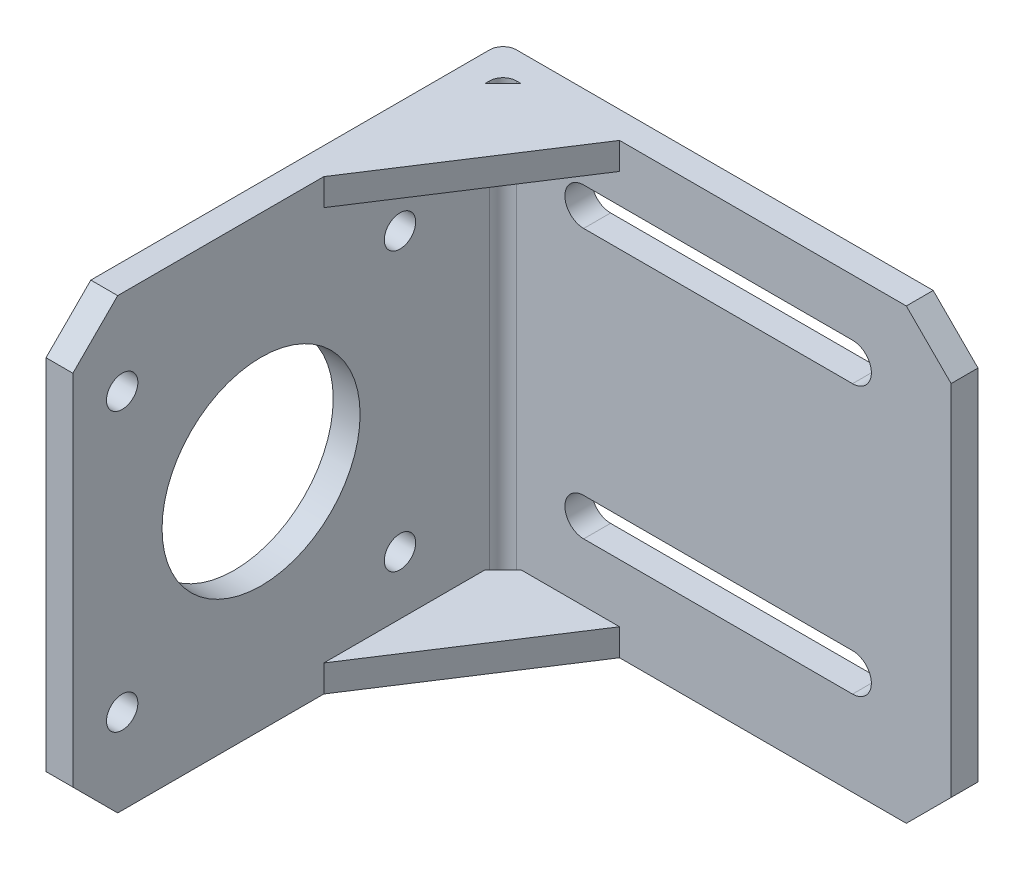
ISO-10303-21;
HEADER;
FILE_DESCRIPTION(('STEP AP214'),'2;1');
FILE_NAME('part.step','',(''),(''),'','','');
FILE_SCHEMA(('AUTOMOTIVE_DESIGN { 1 0 10303 214 1 1 1 1 }'));
ENDSEC;
DATA;
#1=APPLICATION_CONTEXT('core data for automotive mechanical design processes');
#2=APPLICATION_PROTOCOL_DEFINITION('international standard','automotive_design',2000,#1);
#3=PRODUCT_CONTEXT('',#1,'mechanical');
#4=PRODUCT('Part','Part','',(#3));
#5=PRODUCT_RELATED_PRODUCT_CATEGORY('part','',(#4));
#6=PRODUCT_DEFINITION_FORMATION('','',#4);
#7=PRODUCT_DEFINITION_CONTEXT('part definition',#1,'design');
#8=PRODUCT_DEFINITION('design','',#6,#7);
#9=PRODUCT_DEFINITION_SHAPE('','',#8);
#10=(LENGTH_UNIT() NAMED_UNIT(*) SI_UNIT(.MILLI.,.METRE.));
#11=(NAMED_UNIT(*) PLANE_ANGLE_UNIT() SI_UNIT($,.RADIAN.));
#12=(NAMED_UNIT(*) SI_UNIT($,.STERADIAN.) SOLID_ANGLE_UNIT());
#13=UNCERTAINTY_MEASURE_WITH_UNIT(LENGTH_MEASURE(1.E-05),#10,'distance_accuracy_value','');
#14=(GEOMETRIC_REPRESENTATION_CONTEXT(3) GLOBAL_UNCERTAINTY_ASSIGNED_CONTEXT((#13)) GLOBAL_UNIT_ASSIGNED_CONTEXT((#10,
#11,#12)) REPRESENTATION_CONTEXT('',''));
#15=CARTESIAN_POINT('',(0.,0.,0.));
#16=DIRECTION('',(0.,0.,1.));
#17=DIRECTION('',(1.,0.,0.));
#18=AXIS2_PLACEMENT_3D('',#15,#16,#17);
#19=CARTESIAN_POINT('',(0.,-36.3083617585939,3.));
#20=DIRECTION('',(0.,1.,0.));
#21=DIRECTION('',(-1.,0.,0.));
#22=AXIS2_PLACEMENT_3D('',#19,#20,#21);
#23=PLANE('',#22);
#24=DIRECTION('',(1.,0.,0.));
#25=VECTOR('',#24,1.);
#26=CARTESIAN_POINT('',(0.,-36.3083617585939,0.));
#27=LINE('',#26,#25);
#28=CARTESIAN_POINT('',(39.0369919094521,-36.3083617585939,0.));
#29=VERTEX_POINT('',#28);
#30=CARTESIAN_POINT('',(69.0369919094521,-36.3083617585939,0.));
#31=VERTEX_POINT('',#30);
#32=EDGE_CURVE('E306',#29,#31,#27,.T.);
#33=ORIENTED_EDGE('',*,*,#32,.T.);
#34=DIRECTION('',(0.,0.,-1.));
#35=VECTOR('',#34,1.);
#36=CARTESIAN_POINT('',(69.0369919094521,-36.3083617585939,3.));
#37=LINE('',#36,#35);
#38=CARTESIAN_POINT('',(69.0369919094521,-36.3083617585939,3.));
#39=VERTEX_POINT('',#38);
#40=EDGE_CURVE('E324',#39,#31,#37,.T.);
#41=ORIENTED_EDGE('',*,*,#40,.F.);
#42=DIRECTION('',(1.,0.,0.));
#43=VECTOR('',#42,1.);
#44=CARTESIAN_POINT('',(0.,-36.3083617585939,3.));
#45=LINE('',#44,#43);
#46=CARTESIAN_POINT('',(39.0369919094521,-36.3083617585939,3.));
#47=VERTEX_POINT('',#46);
#48=EDGE_CURVE('E276',#47,#39,#45,.T.);
#49=ORIENTED_EDGE('',*,*,#48,.F.);
#50=DIRECTION('',(0.,0.,-1.));
#51=VECTOR('',#50,1.);
#52=CARTESIAN_POINT('',(39.0369919094521,-36.3083617585939,3.));
#53=LINE('',#52,#51);
#54=EDGE_CURVE('E317',#47,#29,#53,.T.);
#55=ORIENTED_EDGE('',*,*,#54,.T.);
#56=EDGE_LOOP('',(#33,#41,#49,#55));
#57=FACE_BOUND('',#56,.T.);
#58=ADVANCED_FACE('F35',(#57),#23,.F.);
#59=CARTESIAN_POINT('',(69.0369919094521,-38.4083617585939,3.));
#60=DIRECTION('',(0.,0.,-1.));
#61=DIRECTION('',(-1.,0.,0.));
#62=AXIS2_PLACEMENT_3D('',#59,#60,#61);
#63=CYLINDRICAL_SURFACE('',#62,2.1);
#64=CARTESIAN_POINT('',(69.0369919094521,-38.4083617585939,0.));
#65=DIRECTION('',(0.,0.,1.));
#66=DIRECTION('',(1.,0.,0.));
#67=AXIS2_PLACEMENT_3D('',#64,#65,#66);
#68=CIRCLE('',#67,2.1);
#69=CARTESIAN_POINT('',(69.0369919094521,-40.5083617585939,0.));
#70=VERTEX_POINT('',#69);
#71=EDGE_CURVE('E309',#31,#70,#68,.F.);
#72=ORIENTED_EDGE('',*,*,#71,.T.);
#73=DIRECTION('',(0.,0.,-1.));
#74=VECTOR('',#73,1.);
#75=CARTESIAN_POINT('',(69.0369919094521,-40.5083617585939,3.));
#76=LINE('',#75,#74);
#77=CARTESIAN_POINT('',(69.0369919094521,-40.5083617585939,3.));
#78=VERTEX_POINT('',#77);
#79=EDGE_CURVE('E322',#78,#70,#76,.T.);
#80=ORIENTED_EDGE('',*,*,#79,.F.);
#81=CARTESIAN_POINT('',(69.0369919094521,-38.4083617585939,3.));
#82=DIRECTION('',(0.,0.,1.));
#83=DIRECTION('',(1.,0.,0.));
#84=AXIS2_PLACEMENT_3D('',#81,#82,#83);
#85=CIRCLE('',#84,2.1);
#86=EDGE_CURVE('E279',#39,#78,#85,.F.);
#87=ORIENTED_EDGE('',*,*,#86,.F.);
#88=ORIENTED_EDGE('',*,*,#40,.T.);
#89=EDGE_LOOP('',(#72,#80,#87,#88));
#90=FACE_BOUND('',#89,.T.);
#91=ADVANCED_FACE('F428',(#90),#63,.F.);
#92=CARTESIAN_POINT('',(0.,-40.5083617585939,3.));
#93=DIRECTION('',(0.,1.,0.));
#94=DIRECTION('',(0.,0.,1.));
#95=AXIS2_PLACEMENT_3D('',#92,#93,#94);
#96=PLANE('',#95);
#97=DIRECTION('',(1.,0.,0.));
#98=VECTOR('',#97,1.);
#99=CARTESIAN_POINT('',(0.,-40.5083617585939,0.));
#100=LINE('',#99,#98);
#101=CARTESIAN_POINT('',(39.0369919094521,-40.5083617585939,0.));
#102=VERTEX_POINT('',#101);
#103=EDGE_CURVE('E312',#102,#70,#100,.T.);
#104=ORIENTED_EDGE('',*,*,#103,.F.);
#105=DIRECTION('',(0.,0.,-1.));
#106=VECTOR('',#105,1.);
#107=CARTESIAN_POINT('',(39.0369919094521,-40.5083617585939,3.));
#108=LINE('',#107,#106);
#109=CARTESIAN_POINT('',(39.0369919094521,-40.5083617585939,3.));
#110=VERTEX_POINT('',#109);
#111=EDGE_CURVE('E319',#110,#102,#108,.T.);
#112=ORIENTED_EDGE('',*,*,#111,.F.);
#113=DIRECTION('',(1.,0.,0.));
#114=VECTOR('',#113,1.);
#115=CARTESIAN_POINT('',(0.,-40.5083617585939,3.));
#116=LINE('',#115,#114);
#117=EDGE_CURVE('E281',#110,#78,#116,.T.);
#118=ORIENTED_EDGE('',*,*,#117,.T.);
#119=ORIENTED_EDGE('',*,*,#79,.T.);
#120=EDGE_LOOP('',(#104,#112,#118,#119));
#121=FACE_BOUND('',#120,.T.);
#122=ADVANCED_FACE('F434',(#121),#96,.T.);
#123=CARTESIAN_POINT('',(0.,-10.508361758594,3.));
#124=DIRECTION('',(0.,1.,0.));
#125=DIRECTION('',(-1.,0.,0.));
#126=AXIS2_PLACEMENT_3D('',#123,#124,#125);
#127=PLANE('',#126);
#128=DIRECTION('',(1.,0.,0.));
#129=VECTOR('',#128,1.);
#130=CARTESIAN_POINT('',(0.,-10.508361758594,0.));
#131=LINE('',#130,#129);
#132=CARTESIAN_POINT('',(39.0369919094521,-10.5083617585939,0.));
#133=VERTEX_POINT('',#132);
#134=CARTESIAN_POINT('',(69.0369919094521,-10.5083617585939,0.));
#135=VERTEX_POINT('',#134);
#136=EDGE_CURVE('E294',#133,#135,#131,.T.);
#137=ORIENTED_EDGE('',*,*,#136,.F.);
#138=DIRECTION('',(0.,0.,-1.));
#139=VECTOR('',#138,1.);
#140=CARTESIAN_POINT('',(39.0369919094521,-10.5083617585939,3.));
#141=LINE('',#140,#139);
#142=CARTESIAN_POINT('',(39.0369919094521,-10.5083617585939,3.));
#143=VERTEX_POINT('',#142);
#144=EDGE_CURVE('E320',#143,#133,#141,.T.);
#145=ORIENTED_EDGE('',*,*,#144,.F.);
#146=DIRECTION('',(1.,0.,0.));
#147=VECTOR('',#146,1.);
#148=CARTESIAN_POINT('',(0.,-10.508361758594,3.));
#149=LINE('',#148,#147);
#150=CARTESIAN_POINT('',(69.0369919094521,-10.5083617585939,3.));
#151=VERTEX_POINT('',#150);
#152=EDGE_CURVE('E265',#143,#151,#149,.T.);
#153=ORIENTED_EDGE('',*,*,#152,.T.);
#154=DIRECTION('',(0.,0.,-1.));
#155=VECTOR('',#154,1.);
#156=CARTESIAN_POINT('',(69.0369919094521,-10.5083617585939,3.));
#157=LINE('',#156,#155);
#158=EDGE_CURVE('E328',#151,#135,#157,.T.);
#159=ORIENTED_EDGE('',*,*,#158,.T.);
#160=EDGE_LOOP('',(#137,#145,#153,#159));
#161=FACE_BOUND('',#160,.T.);
#162=ADVANCED_FACE('F452',(#161),#127,.T.);
#163=CARTESIAN_POINT('',(39.0369919094521,-8.40836175859393,3.));
#164=DIRECTION('',(0.,0.,-1.));
#165=DIRECTION('',(-1.,0.,0.));
#166=AXIS2_PLACEMENT_3D('',#163,#164,#165);
#167=CYLINDRICAL_SURFACE('',#166,2.1);
#168=CARTESIAN_POINT('',(39.0369919094521,-8.40836175859393,0.));
#169=DIRECTION('',(0.,0.,1.));
#170=DIRECTION('',(1.,0.,0.));
#171=AXIS2_PLACEMENT_3D('',#168,#169,#170);
#172=CIRCLE('',#171,2.1);
#173=CARTESIAN_POINT('',(39.0369919094521,-6.30836175859393,0.));
#174=VERTEX_POINT('',#173);
#175=EDGE_CURVE('E297',#133,#174,#172,.F.);
#176=ORIENTED_EDGE('',*,*,#175,.T.);
#177=DIRECTION('',(0.,0.,-1.));
#178=VECTOR('',#177,1.);
#179=CARTESIAN_POINT('',(39.0369919094521,-6.30836175859393,3.));
#180=LINE('',#179,#178);
#181=CARTESIAN_POINT('',(39.0369919094521,-6.30836175859393,3.));
#182=VERTEX_POINT('',#181);
#183=EDGE_CURVE('E334',#182,#174,#180,.T.);
#184=ORIENTED_EDGE('',*,*,#183,.F.);
#185=CARTESIAN_POINT('',(39.0369919094521,-8.40836175859393,3.));
#186=DIRECTION('',(0.,0.,1.));
#187=DIRECTION('',(1.,0.,0.));
#188=AXIS2_PLACEMENT_3D('',#185,#186,#187);
#189=CIRCLE('',#188,2.1);
#190=EDGE_CURVE('E268',#143,#182,#189,.F.);
#191=ORIENTED_EDGE('',*,*,#190,.F.);
#192=ORIENTED_EDGE('',*,*,#144,.T.);
#193=EDGE_LOOP('',(#176,#184,#191,#192));
#194=FACE_BOUND('',#193,.T.);
#195=ADVANCED_FACE('F448',(#194),#167,.F.);
#196=CARTESIAN_POINT('',(0.,-6.30836175859393,3.));
#197=DIRECTION('',(0.,1.,0.));
#198=DIRECTION('',(-1.,0.,0.));
#199=AXIS2_PLACEMENT_3D('',#196,#197,#198);
#200=PLANE('',#199);
#201=DIRECTION('',(1.,0.,0.));
#202=VECTOR('',#201,1.);
#203=CARTESIAN_POINT('',(0.,-6.30836175859393,0.));
#204=LINE('',#203,#202);
#205=CARTESIAN_POINT('',(69.0369919094521,-6.30836175859393,0.));
#206=VERTEX_POINT('',#205);
#207=EDGE_CURVE('E300',#174,#206,#204,.T.);
#208=ORIENTED_EDGE('',*,*,#207,.T.);
#209=DIRECTION('',(0.,0.,-1.));
#210=VECTOR('',#209,1.);
#211=CARTESIAN_POINT('',(69.0369919094521,-6.30836175859393,3.));
#212=LINE('',#211,#210);
#213=CARTESIAN_POINT('',(69.0369919094521,-6.30836175859393,3.));
#214=VERTEX_POINT('',#213);
#215=EDGE_CURVE('E330',#214,#206,#212,.T.);
#216=ORIENTED_EDGE('',*,*,#215,.F.);
#217=DIRECTION('',(1.,0.,0.));
#218=VECTOR('',#217,1.);
#219=CARTESIAN_POINT('',(0.,-6.30836175859393,3.));
#220=LINE('',#219,#218);
#221=EDGE_CURVE('E271',#182,#214,#220,.T.);
#222=ORIENTED_EDGE('',*,*,#221,.F.);
#223=ORIENTED_EDGE('',*,*,#183,.T.);
#224=EDGE_LOOP('',(#208,#216,#222,#223));
#225=FACE_BOUND('',#224,.T.);
#226=ADVANCED_FACE('F444',(#225),#200,.F.);
#227=CARTESIAN_POINT('',(80.0369919094521,0.,3.));
#228=DIRECTION('',(1.,0.,0.));
#229=DIRECTION('',(0.,1.,0.));
#230=AXIS2_PLACEMENT_3D('',#227,#228,#229);
#231=PLANE('',#230);
#232=DIRECTION('',(0.,-1.,0.));
#233=VECTOR('',#232,1.);
#234=CARTESIAN_POINT('',(80.0369919094521,0.,0.));
#235=LINE('',#234,#233);
#236=CARTESIAN_POINT('',(80.0369919094521,-4.99999999999999,0.));
#237=VERTEX_POINT('',#236);
#238=CARTESIAN_POINT('',(80.0369919094521,-45.,0.));
#239=VERTEX_POINT('',#238);
#240=EDGE_CURVE('E255',#237,#239,#235,.T.);
#241=ORIENTED_EDGE('',*,*,#240,.F.);
#242=DIRECTION('',(0.,0.,1.));
#243=VECTOR('',#242,1.);
#244=CARTESIAN_POINT('',(80.0369919094521,-4.99999999999999,3.));
#245=LINE('',#244,#243);
#246=CARTESIAN_POINT('',(80.0369919094521,-4.99999999999999,3.));
#247=VERTEX_POINT('',#246);
#248=EDGE_CURVE('E390',#237,#247,#245,.T.);
#249=ORIENTED_EDGE('',*,*,#248,.T.);
#250=DIRECTION('',(0.,-1.,0.));
#251=VECTOR('',#250,1.);
#252=CARTESIAN_POINT('',(80.0369919094521,0.,3.));
#253=LINE('',#252,#251);
#254=CARTESIAN_POINT('',(80.0369919094521,-45.,3.));
#255=VERTEX_POINT('',#254);
#256=EDGE_CURVE('E256',#247,#255,#253,.T.);
#257=ORIENTED_EDGE('',*,*,#256,.T.);
#258=DIRECTION('',(0.,0.,-1.));
#259=VECTOR('',#258,1.);
#260=CARTESIAN_POINT('',(80.0369919094521,-45.,0.));
#261=LINE('',#260,#259);
#262=EDGE_CURVE('E387',#255,#239,#261,.T.);
#263=ORIENTED_EDGE('',*,*,#262,.T.);
#264=EDGE_LOOP('',(#241,#249,#257,#263));
#265=FACE_BOUND('',#264,.T.);
#266=ADVANCED_FACE('F447',(#265),#231,.T.);
#267=CARTESIAN_POINT('',(0.,0.,3.));
#268=DIRECTION('',(0.,1.,0.));
#269=DIRECTION('',(-1.,0.,0.));
#270=AXIS2_PLACEMENT_3D('',#267,#268,#269);
#271=PLANE('',#270);
#272=DIRECTION('',(0.,0.,-1.));
#273=VECTOR('',#272,1.);
#274=CARTESIAN_POINT('',(30.0369919094521,0.,51.));
#275=LINE('',#274,#273);
#276=CARTESIAN_POINT('',(30.0369919094521,0.,4.99999999999999));
#277=VERTEX_POINT('',#276);
#278=CARTESIAN_POINT('',(30.0369919094521,0.,4.5));
#279=VERTEX_POINT('',#278);
#280=EDGE_CURVE('E234',#277,#279,#275,.T.);
#281=ORIENTED_EDGE('',*,*,#280,.T.);
#282=CARTESIAN_POINT('',(31.5369919094521,0.,4.5));
#283=DIRECTION('',(0.,1.,0.));
#284=DIRECTION('',(-1.,0.,0.));
#285=AXIS2_PLACEMENT_3D('',#282,#283,#284);
#286=CIRCLE('',#285,1.5);
#287=CARTESIAN_POINT('',(31.5369919094521,0.,3.));
#288=VERTEX_POINT('',#287);
#289=EDGE_CURVE('E43',#279,#288,#286,.F.);
#290=ORIENTED_EDGE('',*,*,#289,.T.);
#291=DIRECTION('',(1.,0.,0.));
#292=VECTOR('',#291,1.);
#293=CARTESIAN_POINT('',(0.,0.,3.));
#294=LINE('',#293,#292);
#295=CARTESIAN_POINT('',(32.0369919094521,0.,3.));
#296=VERTEX_POINT('',#295);
#297=EDGE_CURVE('E235',#288,#296,#294,.T.);
#298=ORIENTED_EDGE('',*,*,#297,.T.);
#299=DIRECTION('',(0.707106781186547,0.,-0.707106781186549));
#300=VECTOR('',#299,1.);
#301=CARTESIAN_POINT('',(17.5184959547261,0.,17.518495954726));
#302=LINE('',#301,#300);
#303=EDGE_CURVE('E223',#277,#296,#302,.T.);
#304=ORIENTED_EDGE('',*,*,#303,.F.);
#305=EDGE_LOOP('',(#281,#290,#298,#304));
#306=FACE_BOUND('',#305,.T.);
#307=DIRECTION('',(1.,0.,0.));
#308=VECTOR('',#307,1.);
#309=CARTESIAN_POINT('',(0.,0.,0.));
#310=LINE('',#309,#308);
#311=CARTESIAN_POINT('',(28.5369919094521,0.,0.));
#312=VERTEX_POINT('',#311);
#313=CARTESIAN_POINT('',(75.0369919094521,0.,0.));
#314=VERTEX_POINT('',#313);
#315=EDGE_CURVE('E290',#312,#314,#310,.T.);
#316=ORIENTED_EDGE('',*,*,#315,.F.);
#317=CARTESIAN_POINT('',(28.5369919094521,0.,1.5));
#318=DIRECTION('',(0.,1.,0.));
#319=DIRECTION('',(-1.,0.,0.));
#320=AXIS2_PLACEMENT_3D('',#317,#318,#319);
#321=CIRCLE('',#320,1.5);
#322=CARTESIAN_POINT('',(27.0369919094521,0.,1.5));
#323=VERTEX_POINT('',#322);
#324=EDGE_CURVE('E404',#312,#323,#321,.T.);
#325=ORIENTED_EDGE('',*,*,#324,.T.);
#326=DIRECTION('',(0.,0.,-1.));
#327=VECTOR('',#326,1.);
#328=CARTESIAN_POINT('',(27.0369919094521,0.,3.));
#329=LINE('',#328,#327);
#330=CARTESIAN_POINT('',(27.0369919094521,0.,46.));
#331=VERTEX_POINT('',#330);
#332=EDGE_CURVE('E331',#331,#323,#329,.T.);
#333=ORIENTED_EDGE('',*,*,#332,.F.);
#334=DIRECTION('',(1.,0.,0.));
#335=VECTOR('',#334,1.);
#336=CARTESIAN_POINT('',(0.,0.,46.));
#337=LINE('',#336,#335);
#338=CARTESIAN_POINT('',(30.0369919094521,0.,46.));
#339=VERTEX_POINT('',#338);
#340=EDGE_CURVE('E380',#331,#339,#337,.T.);
#341=ORIENTED_EDGE('',*,*,#340,.T.);
#342=CARTESIAN_POINT('',(30.0369919094521,0.,23.));
#343=VERTEX_POINT('',#342);
#344=EDGE_CURVE('E243',#339,#343,#275,.T.);
#345=ORIENTED_EDGE('',*,*,#344,.T.);
#346=DIRECTION('',(-0.544988350595414,0.,0.838443616300637));
#347=VECTOR('',#346,1.);
#348=CARTESIAN_POINT('',(31.6253018695621,0.,20.5564462152154));
#349=LINE('',#348,#347);
#350=CARTESIAN_POINT('',(43.0369919094521,0.,3.));
#351=VERTEX_POINT('',#350);
#352=EDGE_CURVE('E230',#351,#343,#349,.T.);
#353=ORIENTED_EDGE('',*,*,#352,.F.);
#354=CARTESIAN_POINT('',(75.0369919094521,0.,3.));
#355=VERTEX_POINT('',#354);
#356=EDGE_CURVE('E259',#351,#355,#294,.T.);
#357=ORIENTED_EDGE('',*,*,#356,.T.);
#358=DIRECTION('',(0.,0.,-1.));
#359=VECTOR('',#358,1.);
#360=CARTESIAN_POINT('',(75.0369919094521,0.,3.));
#361=LINE('',#360,#359);
#362=EDGE_CURVE('E377',#355,#314,#361,.T.);
#363=ORIENTED_EDGE('',*,*,#362,.T.);
#364=EDGE_LOOP('',(#316,#325,#333,#341,#345,#353,#357,#363));
#365=FACE_BOUND('',#364,.T.);
#366=ADVANCED_FACE('F232',(#306,#365),#271,.T.);
#367=CARTESIAN_POINT('',(27.0369919094521,0.,3.));
#368=DIRECTION('',(1.,0.,0.));
#369=DIRECTION('',(0.,1.,0.));
#370=AXIS2_PLACEMENT_3D('',#367,#368,#369);
#371=PLANE('',#370);
#372=CARTESIAN_POINT('',(27.0369919094521,-9.50000000000001,14.5));
#373=DIRECTION('',(-1.,0.,0.));
#374=DIRECTION('',(0.,-1.,0.));
#375=AXIS2_PLACEMENT_3D('',#372,#373,#374);
#376=CIRCLE('',#375,1.75);
#377=CARTESIAN_POINT('',(27.0369919094521,-11.25,14.5));
#378=VERTEX_POINT('',#377);
#379=EDGE_CURVE('E350',#378,#378,#376,.T.);
#380=ORIENTED_EDGE('',*,*,#379,.F.);
#381=EDGE_LOOP('',(#380));
#382=FACE_BOUND('',#381,.T.);
#383=CARTESIAN_POINT('',(27.0369919094521,-9.5,45.5));
#384=DIRECTION('',(-1.,0.,0.));
#385=DIRECTION('',(0.,-1.,0.));
#386=AXIS2_PLACEMENT_3D('',#383,#384,#385);
#387=CIRCLE('',#386,1.75);
#388=CARTESIAN_POINT('',(27.0369919094521,-11.25,45.5));
#389=VERTEX_POINT('',#388);
#390=EDGE_CURVE('E553',#389,#389,#387,.T.);
#391=ORIENTED_EDGE('',*,*,#390,.F.);
#392=EDGE_LOOP('',(#391));
#393=FACE_BOUND('',#392,.T.);
#394=CARTESIAN_POINT('',(27.0369919094521,-40.5,45.5));
#395=DIRECTION('',(-1.,0.,0.));
#396=DIRECTION('',(0.,-1.,0.));
#397=AXIS2_PLACEMENT_3D('',#394,#395,#396);
#398=CIRCLE('',#397,1.75);
#399=CARTESIAN_POINT('',(27.0369919094521,-42.25,45.5));
#400=VERTEX_POINT('',#399);
#401=EDGE_CURVE('E556',#400,#400,#398,.T.);
#402=ORIENTED_EDGE('',*,*,#401,.F.);
#403=EDGE_LOOP('',(#402));
#404=FACE_BOUND('',#403,.T.);
#405=CARTESIAN_POINT('',(27.0369919094521,-40.5,14.5));
#406=DIRECTION('',(-1.,0.,0.));
#407=DIRECTION('',(0.,-1.,0.));
#408=AXIS2_PLACEMENT_3D('',#405,#406,#407);
#409=CIRCLE('',#408,1.75);
#410=CARTESIAN_POINT('',(27.0369919094521,-42.25,14.5));
#411=VERTEX_POINT('',#410);
#412=EDGE_CURVE('E544',#411,#411,#409,.T.);
#413=ORIENTED_EDGE('',*,*,#412,.F.);
#414=EDGE_LOOP('',(#413));
#415=FACE_BOUND('',#414,.T.);
#416=CARTESIAN_POINT('',(27.0369919094521,-25.,30.));
#417=DIRECTION('',(-1.,0.,0.));
#418=DIRECTION('',(0.,-1.,0.));
#419=AXIS2_PLACEMENT_3D('',#416,#417,#418);
#420=CIRCLE('',#419,11.05);
#421=CARTESIAN_POINT('',(27.0369919094521,-36.05,30.));
#422=VERTEX_POINT('',#421);
#423=EDGE_CURVE('E345',#422,#422,#420,.T.);
#424=ORIENTED_EDGE('',*,*,#423,.F.);
#425=EDGE_LOOP('',(#424));
#426=FACE_BOUND('',#425,.T.);
#427=ORIENTED_EDGE('',*,*,#332,.T.);
#428=DIRECTION('',(0.,-1.,0.));
#429=VECTOR('',#428,1.);
#430=CARTESIAN_POINT('',(27.0369919094521,0.,1.5));
#431=LINE('',#430,#429);
#432=CARTESIAN_POINT('',(27.0369919094521,-50.,1.5));
#433=VERTEX_POINT('',#432);
#434=EDGE_CURVE('E397',#323,#433,#431,.T.);
#435=ORIENTED_EDGE('',*,*,#434,.T.);
#436=DIRECTION('',(0.,0.,-1.));
#437=VECTOR('',#436,1.);
#438=CARTESIAN_POINT('',(27.0369919094521,-50.,3.));
#439=LINE('',#438,#437);
#440=CARTESIAN_POINT('',(27.0369919094521,-50.,46.));
#441=VERTEX_POINT('',#440);
#442=EDGE_CURVE('E287',#441,#433,#439,.T.);
#443=ORIENTED_EDGE('',*,*,#442,.F.);
#444=DIRECTION('',(0.,0.707106781186547,0.707106781186549));
#445=VECTOR('',#444,1.);
#446=CARTESIAN_POINT('',(27.0369919094521,-45.,51.));
#447=LINE('',#446,#445);
#448=CARTESIAN_POINT('',(27.0369919094521,-45.,51.));
#449=VERTEX_POINT('',#448);
#450=EDGE_CURVE('E375',#441,#449,#447,.T.);
#451=ORIENTED_EDGE('',*,*,#450,.T.);
#452=DIRECTION('',(0.,-1.,0.));
#453=VECTOR('',#452,1.);
#454=CARTESIAN_POINT('',(27.0369919094521,0.,51.));
#455=LINE('',#454,#453);
#456=CARTESIAN_POINT('',(27.0369919094521,-4.99999999999997,51.));
#457=VERTEX_POINT('',#456);
#458=EDGE_CURVE('E249',#457,#449,#455,.T.);
#459=ORIENTED_EDGE('',*,*,#458,.F.);
#460=DIRECTION('',(0.,-0.707106781186547,0.707106781186548));
#461=VECTOR('',#460,1.);
#462=CARTESIAN_POINT('',(27.0369919094521,-4.99999999999997,51.));
#463=LINE('',#462,#461);
#464=EDGE_CURVE('E373',#457,#331,#463,.F.);
#465=ORIENTED_EDGE('',*,*,#464,.T.);
#466=EDGE_LOOP('',(#427,#435,#443,#451,#459,#465));
#467=FACE_BOUND('',#466,.T.);
#468=ADVANCED_FACE('F442',(#382,#393,#404,#415,#426,#467),#371,.F.);
#469=CARTESIAN_POINT('',(69.0369919094521,-8.40836175859392,3.));
#470=DIRECTION('',(0.,0.,-1.));
#471=DIRECTION('',(-1.,0.,0.));
#472=AXIS2_PLACEMENT_3D('',#469,#470,#471);
#473=CYLINDRICAL_SURFACE('',#472,2.09999999999999);
#474=CARTESIAN_POINT('',(69.0369919094521,-8.40836175859392,0.));
#475=DIRECTION('',(0.,0.,1.));
#476=DIRECTION('',(1.,0.,0.));
#477=AXIS2_PLACEMENT_3D('',#474,#475,#476);
#478=CIRCLE('',#477,2.09999999999999);
#479=EDGE_CURVE('E303',#206,#135,#478,.F.);
#480=ORIENTED_EDGE('',*,*,#479,.T.);
#481=ORIENTED_EDGE('',*,*,#158,.F.);
#482=CARTESIAN_POINT('',(69.0369919094521,-8.40836175859392,3.));
#483=DIRECTION('',(0.,0.,1.));
#484=DIRECTION('',(1.,0.,0.));
#485=AXIS2_PLACEMENT_3D('',#482,#483,#484);
#486=CIRCLE('',#485,2.09999999999999);
#487=EDGE_CURVE('E274',#214,#151,#486,.F.);
#488=ORIENTED_EDGE('',*,*,#487,.F.);
#489=ORIENTED_EDGE('',*,*,#215,.T.);
#490=EDGE_LOOP('',(#480,#481,#488,#489));
#491=FACE_BOUND('',#490,.T.);
#492=ADVANCED_FACE('F439',(#491),#473,.F.);
#493=CARTESIAN_POINT('',(0.,-50.,3.));
#494=DIRECTION('',(0.,1.,0.));
#495=DIRECTION('',(-1.,0.,0.));
#496=AXIS2_PLACEMENT_3D('',#493,#494,#495);
#497=PLANE('',#496);
#498=DIRECTION('',(0.707106781186547,0.,-0.707106781186549));
#499=VECTOR('',#498,1.);
#500=CARTESIAN_POINT('',(17.5184959547261,-50.,17.518495954726));
#501=LINE('',#500,#499);
#502=CARTESIAN_POINT('',(30.0369919094521,-50.,4.99999999999999));
#503=VERTEX_POINT('',#502);
#504=CARTESIAN_POINT('',(32.0369919094521,-50.,3.));
#505=VERTEX_POINT('',#504);
#506=EDGE_CURVE('E419',#503,#505,#501,.T.);
#507=ORIENTED_EDGE('',*,*,#506,.T.);
#508=DIRECTION('',(1.,0.,0.));
#509=VECTOR('',#508,1.);
#510=CARTESIAN_POINT('',(0.,-50.,3.));
#511=LINE('',#510,#509);
#512=CARTESIAN_POINT('',(31.5369919094521,-50.,3.));
#513=VERTEX_POINT('',#512);
#514=EDGE_CURVE('E263',#513,#505,#511,.T.);
#515=ORIENTED_EDGE('',*,*,#514,.F.);
#516=CARTESIAN_POINT('',(31.5369919094521,-50.,4.5));
#517=DIRECTION('',(0.,1.,0.));
#518=DIRECTION('',(-1.,0.,0.));
#519=AXIS2_PLACEMENT_3D('',#516,#517,#518);
#520=CIRCLE('',#519,1.5);
#521=CARTESIAN_POINT('',(30.0369919094521,-50.,4.5));
#522=VERTEX_POINT('',#521);
#523=EDGE_CURVE('E11',#513,#522,#520,.T.);
#524=ORIENTED_EDGE('',*,*,#523,.T.);
#525=DIRECTION('',(0.,0.,-1.));
#526=VECTOR('',#525,1.);
#527=CARTESIAN_POINT('',(30.0369919094521,-50.,51.));
#528=LINE('',#527,#526);
#529=EDGE_CURVE('E247',#503,#522,#528,.T.);
#530=ORIENTED_EDGE('',*,*,#529,.F.);
#531=EDGE_LOOP('',(#507,#515,#524,#530));
#532=FACE_BOUND('',#531,.T.);
#533=ORIENTED_EDGE('',*,*,#442,.T.);
#534=CARTESIAN_POINT('',(28.5369919094521,-50.,1.5));
#535=DIRECTION('',(0.,1.,0.));
#536=DIRECTION('',(-1.,0.,0.));
#537=AXIS2_PLACEMENT_3D('',#534,#535,#536);
#538=CIRCLE('',#537,1.5);
#539=CARTESIAN_POINT('',(28.5369919094521,-50.,0.));
#540=VERTEX_POINT('',#539);
#541=EDGE_CURVE('E400',#433,#540,#538,.F.);
#542=ORIENTED_EDGE('',*,*,#541,.T.);
#543=DIRECTION('',(1.,0.,0.));
#544=VECTOR('',#543,1.);
#545=CARTESIAN_POINT('',(0.,-50.,0.));
#546=LINE('',#545,#544);
#547=CARTESIAN_POINT('',(75.0369919094521,-50.,0.));
#548=VERTEX_POINT('',#547);
#549=EDGE_CURVE('E292',#540,#548,#546,.T.);
#550=ORIENTED_EDGE('',*,*,#549,.T.);
#551=DIRECTION('',(0.,0.,1.));
#552=VECTOR('',#551,1.);
#553=CARTESIAN_POINT('',(75.0369919094521,-50.,3.));
#554=LINE('',#553,#552);
#555=CARTESIAN_POINT('',(75.0369919094521,-50.,3.));
#556=VERTEX_POINT('',#555);
#557=EDGE_CURVE('E368',#548,#556,#554,.T.);
#558=ORIENTED_EDGE('',*,*,#557,.T.);
#559=CARTESIAN_POINT('',(43.0369919094521,-50.,3.));
#560=VERTEX_POINT('',#559);
#561=EDGE_CURVE('E262',#560,#556,#511,.T.);
#562=ORIENTED_EDGE('',*,*,#561,.F.);
#563=DIRECTION('',(-0.544988350595414,0.,0.838443616300637));
#564=VECTOR('',#563,1.);
#565=CARTESIAN_POINT('',(31.6253018695621,-50.,20.5564462152154));
#566=LINE('',#565,#564);
#567=CARTESIAN_POINT('',(30.0369919094521,-50.,23.));
#568=VERTEX_POINT('',#567);
#569=EDGE_CURVE('E528',#560,#568,#566,.T.);
#570=ORIENTED_EDGE('',*,*,#569,.T.);
#571=CARTESIAN_POINT('',(30.0369919094521,-50.,46.));
#572=VERTEX_POINT('',#571);
#573=EDGE_CURVE('E253',#572,#568,#528,.T.);
#574=ORIENTED_EDGE('',*,*,#573,.F.);
#575=DIRECTION('',(-1.,0.,0.));
#576=VECTOR('',#575,1.);
#577=CARTESIAN_POINT('',(27.0369919094521,-50.,46.));
#578=LINE('',#577,#576);
#579=EDGE_CURVE('E371',#572,#441,#578,.T.);
#580=ORIENTED_EDGE('',*,*,#579,.T.);
#581=EDGE_LOOP('',(#533,#542,#550,#558,#562,#570,#574,#580));
#582=FACE_BOUND('',#581,.T.);
#583=ADVANCED_FACE('F416',(#532,#582),#497,.F.);
#584=CARTESIAN_POINT('',(39.0369919094521,-38.4083617585939,3.));
#585=DIRECTION('',(0.,0.,-1.));
#586=DIRECTION('',(-1.,0.,0.));
#587=AXIS2_PLACEMENT_3D('',#584,#585,#586);
#588=CYLINDRICAL_SURFACE('',#587,2.1);
#589=CARTESIAN_POINT('',(39.0369919094521,-38.4083617585939,0.));
#590=DIRECTION('',(0.,0.,1.));
#591=DIRECTION('',(1.,0.,0.));
#592=AXIS2_PLACEMENT_3D('',#589,#590,#591);
#593=CIRCLE('',#592,2.1);
#594=EDGE_CURVE('E260',#29,#102,#593,.T.);
#595=ORIENTED_EDGE('',*,*,#594,.F.);
#596=ORIENTED_EDGE('',*,*,#54,.F.);
#597=CARTESIAN_POINT('',(39.0369919094521,-38.4083617585939,3.));
#598=DIRECTION('',(0.,0.,1.));
#599=DIRECTION('',(1.,0.,0.));
#600=AXIS2_PLACEMENT_3D('',#597,#598,#599);
#601=CIRCLE('',#600,2.1);
#602=EDGE_CURVE('E284',#47,#110,#601,.T.);
#603=ORIENTED_EDGE('',*,*,#602,.T.);
#604=ORIENTED_EDGE('',*,*,#111,.T.);
#605=EDGE_LOOP('',(#595,#596,#603,#604));
#606=FACE_BOUND('',#605,.T.);
#607=ADVANCED_FACE('F459',(#606),#588,.F.);
#608=CARTESIAN_POINT('',(0.,0.,3.));
#609=DIRECTION('',(0.,0.,1.));
#610=DIRECTION('',(1.,0.,0.));
#611=AXIS2_PLACEMENT_3D('',#608,#609,#610);
#612=PLANE('',#611);
#613=ORIENTED_EDGE('',*,*,#297,.F.);
#614=DIRECTION('',(0.,1.,0.));
#615=VECTOR('',#614,1.);
#616=CARTESIAN_POINT('',(31.5369919094521,0.,3.));
#617=LINE('',#616,#615);
#618=EDGE_CURVE('E407',#288,#513,#617,.F.);
#619=ORIENTED_EDGE('',*,*,#618,.T.);
#620=ORIENTED_EDGE('',*,*,#514,.T.);
#621=DIRECTION('',(0.,-1.,0.));
#622=VECTOR('',#621,1.);
#623=CARTESIAN_POINT('',(32.0369919094521,-47.,3.));
#624=LINE('',#623,#622);
#625=CARTESIAN_POINT('',(32.0369919094521,-47.,3.));
#626=VERTEX_POINT('',#625);
#627=EDGE_CURVE('E547',#626,#505,#624,.T.);
#628=ORIENTED_EDGE('',*,*,#627,.F.);
#629=DIRECTION('',(-1.,0.,0.));
#630=VECTOR('',#629,1.);
#631=CARTESIAN_POINT('',(0.,-47.,3.));
#632=LINE('',#631,#630);
#633=CARTESIAN_POINT('',(43.0369919094521,-47.,3.));
#634=VERTEX_POINT('',#633);
#635=EDGE_CURVE('E531',#634,#626,#632,.T.);
#636=ORIENTED_EDGE('',*,*,#635,.F.);
#637=DIRECTION('',(0.,-1.,0.));
#638=VECTOR('',#637,1.);
#639=CARTESIAN_POINT('',(43.0369919094521,-47.,3.));
#640=LINE('',#639,#638);
#641=EDGE_CURVE('E545',#634,#560,#640,.T.);
#642=ORIENTED_EDGE('',*,*,#641,.T.);
#643=ORIENTED_EDGE('',*,*,#561,.T.);
#644=DIRECTION('',(0.707106781186547,0.707106781186548,0.));
#645=VECTOR('',#644,1.);
#646=CARTESIAN_POINT('',(62.5184959547261,-62.518495954726,3.));
#647=LINE('',#646,#645);
#648=EDGE_CURVE('E392',#556,#255,#647,.T.);
#649=ORIENTED_EDGE('',*,*,#648,.T.);
#650=ORIENTED_EDGE('',*,*,#256,.F.);
#651=DIRECTION('',(0.707106781186547,-0.707106781186548,0.));
#652=VECTOR('',#651,1.);
#653=CARTESIAN_POINT('',(37.5184959547261,37.5184959547261,3.));
#654=LINE('',#653,#652);
#655=EDGE_CURVE('E394',#247,#355,#654,.F.);
#656=ORIENTED_EDGE('',*,*,#655,.T.);
#657=ORIENTED_EDGE('',*,*,#356,.F.);
#658=DIRECTION('',(0.,-1.,0.));
#659=VECTOR('',#658,1.);
#660=CARTESIAN_POINT('',(43.0369919094521,0.,3.));
#661=LINE('',#660,#659);
#662=CARTESIAN_POINT('',(43.0369919094521,-3.00000000000001,3.));
#663=VERTEX_POINT('',#662);
#664=EDGE_CURVE('E502',#351,#663,#661,.T.);
#665=ORIENTED_EDGE('',*,*,#664,.T.);
#666=DIRECTION('',(-1.,0.,0.));
#667=VECTOR('',#666,1.);
#668=CARTESIAN_POINT('',(0.,-3.00000000000002,3.));
#669=LINE('',#668,#667);
#670=CARTESIAN_POINT('',(32.0369919094521,-3.00000000000001,3.));
#671=VERTEX_POINT('',#670);
#672=EDGE_CURVE('E519',#663,#671,#669,.T.);
#673=ORIENTED_EDGE('',*,*,#672,.T.);
#674=DIRECTION('',(0.,-1.,0.));
#675=VECTOR('',#674,1.);
#676=CARTESIAN_POINT('',(32.0369919094521,0.,3.));
#677=LINE('',#676,#675);
#678=EDGE_CURVE('E229',#296,#671,#677,.T.);
#679=ORIENTED_EDGE('',*,*,#678,.F.);
#680=EDGE_LOOP('',(#613,#619,#620,#628,#636,#642,#643,#649,#650,#656,#657,#665,#673,#679));
#681=FACE_BOUND('',#680,.T.);
#682=ORIENTED_EDGE('',*,*,#152,.F.);
#683=ORIENTED_EDGE('',*,*,#190,.T.);
#684=ORIENTED_EDGE('',*,*,#221,.T.);
#685=ORIENTED_EDGE('',*,*,#487,.T.);
#686=EDGE_LOOP('',(#682,#683,#684,#685));
#687=FACE_BOUND('',#686,.T.);
#688=ORIENTED_EDGE('',*,*,#48,.T.);
#689=ORIENTED_EDGE('',*,*,#86,.T.);
#690=ORIENTED_EDGE('',*,*,#117,.F.);
#691=ORIENTED_EDGE('',*,*,#602,.F.);
#692=EDGE_LOOP('',(#688,#689,#690,#691));
#693=FACE_BOUND('',#692,.T.);
#694=ADVANCED_FACE('F410',(#681,#687,#693),#612,.T.);
#695=CARTESIAN_POINT('',(0.,0.,0.));
#696=DIRECTION('',(0.,0.,1.));
#697=DIRECTION('',(1.,0.,0.));
#698=AXIS2_PLACEMENT_3D('',#695,#696,#697);
#699=PLANE('',#698);
#700=ORIENTED_EDGE('',*,*,#549,.F.);
#701=DIRECTION('',(0.,-1.,0.));
#702=VECTOR('',#701,1.);
#703=CARTESIAN_POINT('',(28.5369919094521,0.,0.));
#704=LINE('',#703,#702);
#705=EDGE_CURVE('E402',#540,#312,#704,.F.);
#706=ORIENTED_EDGE('',*,*,#705,.T.);
#707=ORIENTED_EDGE('',*,*,#315,.T.);
#708=DIRECTION('',(-0.707106781186547,0.707106781186548,0.));
#709=VECTOR('',#708,1.);
#710=CARTESIAN_POINT('',(75.0369919094521,0.,0.));
#711=LINE('',#710,#709);
#712=EDGE_CURVE('E385',#314,#237,#711,.F.);
#713=ORIENTED_EDGE('',*,*,#712,.T.);
#714=ORIENTED_EDGE('',*,*,#240,.T.);
#715=DIRECTION('',(-0.707106781186547,-0.707106781186548,0.));
#716=VECTOR('',#715,1.);
#717=CARTESIAN_POINT('',(80.0369919094521,-45.,0.));
#718=LINE('',#717,#716);
#719=EDGE_CURVE('E382',#239,#548,#718,.T.);
#720=ORIENTED_EDGE('',*,*,#719,.T.);
#721=EDGE_LOOP('',(#700,#706,#707,#713,#714,#720));
#722=FACE_BOUND('',#721,.T.);
#723=ORIENTED_EDGE('',*,*,#136,.T.);
#724=ORIENTED_EDGE('',*,*,#479,.F.);
#725=ORIENTED_EDGE('',*,*,#207,.F.);
#726=ORIENTED_EDGE('',*,*,#175,.F.);
#727=EDGE_LOOP('',(#723,#724,#725,#726));
#728=FACE_BOUND('',#727,.T.);
#729=ORIENTED_EDGE('',*,*,#32,.F.);
#730=ORIENTED_EDGE('',*,*,#594,.T.);
#731=ORIENTED_EDGE('',*,*,#103,.T.);
#732=ORIENTED_EDGE('',*,*,#71,.F.);
#733=EDGE_LOOP('',(#729,#730,#731,#732));
#734=FACE_BOUND('',#733,.T.);
#735=ADVANCED_FACE('F612',(#722,#728,#734),#699,.F.);
#736=CARTESIAN_POINT('',(30.0369919094521,0.,51.));
#737=DIRECTION('',(-1.,0.,0.));
#738=DIRECTION('',(0.,-1.,0.));
#739=AXIS2_PLACEMENT_3D('',#736,#737,#738);
#740=PLANE('',#739);
#741=ORIENTED_EDGE('',*,*,#529,.T.);
#742=DIRECTION('',(0.,1.,0.));
#743=VECTOR('',#742,1.);
#744=CARTESIAN_POINT('',(30.0369919094521,0.,4.5));
#745=LINE('',#744,#743);
#746=EDGE_CURVE('E242',#522,#279,#745,.T.);
#747=ORIENTED_EDGE('',*,*,#746,.T.);
#748=ORIENTED_EDGE('',*,*,#280,.F.);
#749=DIRECTION('',(0.,-1.,0.));
#750=VECTOR('',#749,1.);
#751=CARTESIAN_POINT('',(30.0369919094521,0.,4.99999999999999));
#752=LINE('',#751,#750);
#753=CARTESIAN_POINT('',(30.0369919094521,-3.00000000000002,4.99999999999999));
#754=VERTEX_POINT('',#753);
#755=EDGE_CURVE('E219',#277,#754,#752,.T.);
#756=ORIENTED_EDGE('',*,*,#755,.T.);
#757=DIRECTION('',(0.,0.,1.));
#758=VECTOR('',#757,1.);
#759=CARTESIAN_POINT('',(30.0369919094521,-3.00000000000002,0.));
#760=LINE('',#759,#758);
#761=CARTESIAN_POINT('',(30.0369919094521,-3.00000000000001,23.));
#762=VERTEX_POINT('',#761);
#763=EDGE_CURVE('E516',#754,#762,#760,.T.);
#764=ORIENTED_EDGE('',*,*,#763,.T.);
#765=DIRECTION('',(0.,-1.,0.));
#766=VECTOR('',#765,1.);
#767=CARTESIAN_POINT('',(30.0369919094521,0.,23.));
#768=LINE('',#767,#766);
#769=EDGE_CURVE('E510',#343,#762,#768,.T.);
#770=ORIENTED_EDGE('',*,*,#769,.F.);
#771=ORIENTED_EDGE('',*,*,#344,.F.);
#772=DIRECTION('',(0.,0.707106781186547,-0.707106781186548));
#773=VECTOR('',#772,1.);
#774=CARTESIAN_POINT('',(30.0369919094521,-4.99999999999997,51.));
#775=LINE('',#774,#773);
#776=CARTESIAN_POINT('',(30.0369919094521,-4.99999999999997,51.));
#777=VERTEX_POINT('',#776);
#778=EDGE_CURVE('E364',#339,#777,#775,.F.);
#779=ORIENTED_EDGE('',*,*,#778,.T.);
#780=DIRECTION('',(0.,1.,0.));
#781=VECTOR('',#780,1.);
#782=CARTESIAN_POINT('',(30.0369919094521,0.,51.));
#783=LINE('',#782,#781);
#784=CARTESIAN_POINT('',(30.0369919094521,-45.,51.));
#785=VERTEX_POINT('',#784);
#786=EDGE_CURVE('E244',#785,#777,#783,.T.);
#787=ORIENTED_EDGE('',*,*,#786,.F.);
#788=DIRECTION('',(0.,-0.707106781186547,-0.707106781186549));
#789=VECTOR('',#788,1.);
#790=CARTESIAN_POINT('',(30.0369919094521,-45.,51.));
#791=LINE('',#790,#789);
#792=EDGE_CURVE('E366',#785,#572,#791,.T.);
#793=ORIENTED_EDGE('',*,*,#792,.T.);
#794=ORIENTED_EDGE('',*,*,#573,.T.);
#795=DIRECTION('',(0.,-1.,0.));
#796=VECTOR('',#795,1.);
#797=CARTESIAN_POINT('',(30.0369919094521,-47.,23.));
#798=LINE('',#797,#796);
#799=CARTESIAN_POINT('',(30.0369919094521,-47.,23.));
#800=VERTEX_POINT('',#799);
#801=EDGE_CURVE('E541',#800,#568,#798,.T.);
#802=ORIENTED_EDGE('',*,*,#801,.F.);
#803=DIRECTION('',(0.,0.,1.));
#804=VECTOR('',#803,1.);
#805=CARTESIAN_POINT('',(30.0369919094521,-47.,0.));
#806=LINE('',#805,#804);
#807=CARTESIAN_POINT('',(30.0369919094521,-47.,4.99999999999999));
#808=VERTEX_POINT('',#807);
#809=EDGE_CURVE('E524',#808,#800,#806,.T.);
#810=ORIENTED_EDGE('',*,*,#809,.F.);
#811=DIRECTION('',(0.,-1.,0.));
#812=VECTOR('',#811,1.);
#813=CARTESIAN_POINT('',(30.0369919094521,-47.,4.99999999999999));
#814=LINE('',#813,#812);
#815=EDGE_CURVE('E537',#808,#503,#814,.T.);
#816=ORIENTED_EDGE('',*,*,#815,.T.);
#817=EDGE_LOOP('',(#741,#747,#748,#756,#764,#770,#771,#779,#787,#793,#794,#802,#810,#816));
#818=FACE_BOUND('',#817,.T.);
#819=CARTESIAN_POINT('',(30.0369919094521,-9.50000000000001,14.5));
#820=DIRECTION('',(-1.,0.,0.));
#821=DIRECTION('',(0.,-1.,0.));
#822=AXIS2_PLACEMENT_3D('',#819,#820,#821);
#823=CIRCLE('',#822,1.75);
#824=CARTESIAN_POINT('',(30.0369919094521,-11.25,14.5));
#825=VERTEX_POINT('',#824);
#826=EDGE_CURVE('E356',#825,#825,#823,.T.);
#827=ORIENTED_EDGE('',*,*,#826,.T.);
#828=EDGE_LOOP('',(#827));
#829=FACE_BOUND('',#828,.T.);
#830=CARTESIAN_POINT('',(30.0369919094521,-9.5,45.5));
#831=DIRECTION('',(-1.,0.,0.));
#832=DIRECTION('',(0.,-1.,0.));
#833=AXIS2_PLACEMENT_3D('',#830,#831,#832);
#834=CIRCLE('',#833,1.75);
#835=CARTESIAN_POINT('',(30.0369919094521,-11.25,45.5));
#836=VERTEX_POINT('',#835);
#837=EDGE_CURVE('E353',#836,#836,#834,.T.);
#838=ORIENTED_EDGE('',*,*,#837,.T.);
#839=EDGE_LOOP('',(#838));
#840=FACE_BOUND('',#839,.T.);
#841=CARTESIAN_POINT('',(30.0369919094521,-40.5,45.5));
#842=DIRECTION('',(-1.,0.,0.));
#843=DIRECTION('',(0.,-1.,0.));
#844=AXIS2_PLACEMENT_3D('',#841,#842,#843);
#845=CIRCLE('',#844,1.75);
#846=CARTESIAN_POINT('',(30.0369919094521,-42.25,45.5));
#847=VERTEX_POINT('',#846);
#848=EDGE_CURVE('E349',#847,#847,#845,.T.);
#849=ORIENTED_EDGE('',*,*,#848,.T.);
#850=EDGE_LOOP('',(#849));
#851=FACE_BOUND('',#850,.T.);
#852=CARTESIAN_POINT('',(30.0369919094521,-40.5,14.5));
#853=DIRECTION('',(-1.,0.,0.));
#854=DIRECTION('',(0.,-1.,0.));
#855=AXIS2_PLACEMENT_3D('',#852,#853,#854);
#856=CIRCLE('',#855,1.75);
#857=CARTESIAN_POINT('',(30.0369919094521,-42.25,14.5));
#858=VERTEX_POINT('',#857);
#859=EDGE_CURVE('E346',#858,#858,#856,.T.);
#860=ORIENTED_EDGE('',*,*,#859,.T.);
#861=EDGE_LOOP('',(#860));
#862=FACE_BOUND('',#861,.T.);
#863=CARTESIAN_POINT('',(30.0369919094521,-25.,30.));
#864=DIRECTION('',(-1.,0.,0.));
#865=DIRECTION('',(0.,-1.,0.));
#866=AXIS2_PLACEMENT_3D('',#863,#864,#865);
#867=CIRCLE('',#866,11.05);
#868=CARTESIAN_POINT('',(30.0369919094521,-36.05,30.));
#869=VERTEX_POINT('',#868);
#870=EDGE_CURVE('E342',#869,#869,#867,.T.);
#871=ORIENTED_EDGE('',*,*,#870,.T.);
#872=EDGE_LOOP('',(#871));
#873=FACE_BOUND('',#872,.T.);
#874=ADVANCED_FACE('F240',(#818,#829,#840,#851,#862,#873),#740,.F.);
#875=CARTESIAN_POINT('',(0.,0.,51.));
#876=DIRECTION('',(0.,0.,1.));
#877=DIRECTION('',(1.,0.,0.));
#878=AXIS2_PLACEMENT_3D('',#875,#876,#877);
#879=PLANE('',#878);
#880=ORIENTED_EDGE('',*,*,#458,.T.);
#881=DIRECTION('',(1.,0.,0.));
#882=VECTOR('',#881,1.);
#883=CARTESIAN_POINT('',(30.0369919094521,-45.,51.));
#884=LINE('',#883,#882);
#885=EDGE_CURVE('E361',#449,#785,#884,.T.);
#886=ORIENTED_EDGE('',*,*,#885,.T.);
#887=ORIENTED_EDGE('',*,*,#786,.T.);
#888=DIRECTION('',(-1.,0.,0.));
#889=VECTOR('',#888,1.);
#890=CARTESIAN_POINT('',(0.,-4.99999999999997,51.));
#891=LINE('',#890,#889);
#892=EDGE_CURVE('E327',#777,#457,#891,.T.);
#893=ORIENTED_EDGE('',*,*,#892,.T.);
#894=EDGE_LOOP('',(#880,#886,#887,#893));
#895=FACE_BOUND('',#894,.T.);
#896=ADVANCED_FACE('F566',(#895),#879,.T.);
#897=CARTESIAN_POINT('',(76.0369919094521,-25.,30.));
#898=DIRECTION('',(-1.,0.,0.));
#899=DIRECTION('',(0.,-1.,0.));
#900=AXIS2_PLACEMENT_3D('',#897,#898,#899);
#901=CYLINDRICAL_SURFACE('',#900,11.05);
#902=ORIENTED_EDGE('',*,*,#423,.T.);
#903=EDGE_LOOP('',(#902));
#904=FACE_BOUND('',#903,.T.);
#905=ORIENTED_EDGE('',*,*,#870,.F.);
#906=EDGE_LOOP('',(#905));
#907=FACE_BOUND('',#906,.T.);
#908=ADVANCED_FACE('F603',(#904,#907),#901,.F.);
#909=CARTESIAN_POINT('',(76.0369919094521,-40.5,14.5));
#910=DIRECTION('',(-1.,0.,0.));
#911=DIRECTION('',(0.,-1.,0.));
#912=AXIS2_PLACEMENT_3D('',#909,#910,#911);
#913=CYLINDRICAL_SURFACE('',#912,1.75);
#914=ORIENTED_EDGE('',*,*,#412,.T.);
#915=EDGE_LOOP('',(#914));
#916=FACE_BOUND('',#915,.T.);
#917=ORIENTED_EDGE('',*,*,#859,.F.);
#918=EDGE_LOOP('',(#917));
#919=FACE_BOUND('',#918,.T.);
#920=ADVANCED_FACE('F599',(#916,#919),#913,.F.);
#921=CARTESIAN_POINT('',(76.0369919094521,-40.5,45.5));
#922=DIRECTION('',(-1.,0.,0.));
#923=DIRECTION('',(0.,-1.,0.));
#924=AXIS2_PLACEMENT_3D('',#921,#922,#923);
#925=CYLINDRICAL_SURFACE('',#924,1.75);
#926=ORIENTED_EDGE('',*,*,#401,.T.);
#927=EDGE_LOOP('',(#926));
#928=FACE_BOUND('',#927,.T.);
#929=ORIENTED_EDGE('',*,*,#848,.F.);
#930=EDGE_LOOP('',(#929));
#931=FACE_BOUND('',#930,.T.);
#932=ADVANCED_FACE('F595',(#928,#931),#925,.F.);
#933=CARTESIAN_POINT('',(76.0369919094521,-9.49999999999999,45.5));
#934=DIRECTION('',(-1.,0.,0.));
#935=DIRECTION('',(0.,-1.,0.));
#936=AXIS2_PLACEMENT_3D('',#933,#934,#935);
#937=CYLINDRICAL_SURFACE('',#936,1.75);
#938=ORIENTED_EDGE('',*,*,#390,.T.);
#939=EDGE_LOOP('',(#938));
#940=FACE_BOUND('',#939,.T.);
#941=ORIENTED_EDGE('',*,*,#837,.F.);
#942=EDGE_LOOP('',(#941));
#943=FACE_BOUND('',#942,.T.);
#944=ADVANCED_FACE('F591',(#940,#943),#937,.F.);
#945=CARTESIAN_POINT('',(76.0369919094521,-9.50000000000001,14.5));
#946=DIRECTION('',(-1.,0.,0.));
#947=DIRECTION('',(0.,-1.,0.));
#948=AXIS2_PLACEMENT_3D('',#945,#946,#947);
#949=CYLINDRICAL_SURFACE('',#948,1.75);
#950=ORIENTED_EDGE('',*,*,#379,.T.);
#951=EDGE_LOOP('',(#950));
#952=FACE_BOUND('',#951,.T.);
#953=ORIENTED_EDGE('',*,*,#826,.F.);
#954=EDGE_LOOP('',(#953));
#955=FACE_BOUND('',#954,.T.);
#956=ADVANCED_FACE('F472',(#952,#955),#949,.F.);
#957=CARTESIAN_POINT('',(0.,-45.,51.));
#958=DIRECTION('',(0.,-0.707106781186549,0.707106781186547));
#959=DIRECTION('',(-1.,0.,0.));
#960=AXIS2_PLACEMENT_3D('',#957,#958,#959);
#961=PLANE('',#960);
#962=ORIENTED_EDGE('',*,*,#450,.F.);
#963=ORIENTED_EDGE('',*,*,#579,.F.);
#964=ORIENTED_EDGE('',*,*,#792,.F.);
#965=ORIENTED_EDGE('',*,*,#885,.F.);
#966=EDGE_LOOP('',(#962,#963,#964,#965));
#967=FACE_BOUND('',#966,.T.);
#968=ADVANCED_FACE('F468',(#967),#961,.T.);
#969=CARTESIAN_POINT('',(0.,-4.99999999999997,51.));
#970=DIRECTION('',(0.,-0.707106781186548,-0.707106781186547));
#971=DIRECTION('',(-1.,0.,0.));
#972=AXIS2_PLACEMENT_3D('',#969,#970,#971);
#973=PLANE('',#972);
#974=ORIENTED_EDGE('',*,*,#778,.F.);
#975=ORIENTED_EDGE('',*,*,#340,.F.);
#976=ORIENTED_EDGE('',*,*,#464,.F.);
#977=ORIENTED_EDGE('',*,*,#892,.F.);
#978=EDGE_LOOP('',(#974,#975,#976,#977));
#979=FACE_BOUND('',#978,.T.);
#980=ADVANCED_FACE('F471',(#979),#973,.F.);
#981=CARTESIAN_POINT('',(75.0369919094521,0.,3.));
#982=DIRECTION('',(-0.707106781186548,-0.707106781186547,0.));
#983=DIRECTION('',(0.,0.,-1.));
#984=AXIS2_PLACEMENT_3D('',#981,#982,#983);
#985=PLANE('',#984);
#986=ORIENTED_EDGE('',*,*,#655,.F.);
#987=ORIENTED_EDGE('',*,*,#248,.F.);
#988=ORIENTED_EDGE('',*,*,#712,.F.);
#989=ORIENTED_EDGE('',*,*,#362,.F.);
#990=EDGE_LOOP('',(#986,#987,#988,#989));
#991=FACE_BOUND('',#990,.T.);
#992=ADVANCED_FACE('F476',(#991),#985,.F.);
#993=CARTESIAN_POINT('',(80.0369919094521,-45.,3.));
#994=DIRECTION('',(0.707106781186548,-0.707106781186547,0.));
#995=DIRECTION('',(0.,0.,1.));
#996=AXIS2_PLACEMENT_3D('',#993,#994,#995);
#997=PLANE('',#996);
#998=ORIENTED_EDGE('',*,*,#648,.F.);
#999=ORIENTED_EDGE('',*,*,#557,.F.);
#1000=ORIENTED_EDGE('',*,*,#719,.F.);
#1001=ORIENTED_EDGE('',*,*,#262,.F.);
#1002=EDGE_LOOP('',(#998,#999,#1000,#1001));
#1003=FACE_BOUND('',#1002,.T.);
#1004=ADVANCED_FACE('F480',(#1003),#997,.T.);
#1005=CARTESIAN_POINT('',(31.6253018695621,-47.,20.5564462152154));
#1006=DIRECTION('',(0.838443616300637,0.,0.544988350595414));
#1007=DIRECTION('',(0.544988350595414,0.,-0.838443616300637));
#1008=AXIS2_PLACEMENT_3D('',#1005,#1006,#1007);
#1009=PLANE('',#1008);
#1010=ORIENTED_EDGE('',*,*,#569,.F.);
#1011=ORIENTED_EDGE('',*,*,#641,.F.);
#1012=DIRECTION('',(-0.544988350595414,0.,0.838443616300637));
#1013=VECTOR('',#1012,1.);
#1014=CARTESIAN_POINT('',(31.6253018695621,-47.,20.5564462152154));
#1015=LINE('',#1014,#1013);
#1016=EDGE_CURVE('E534',#634,#800,#1015,.T.);
#1017=ORIENTED_EDGE('',*,*,#1016,.T.);
#1018=ORIENTED_EDGE('',*,*,#801,.T.);
#1019=EDGE_LOOP('',(#1010,#1011,#1017,#1018));
#1020=FACE_BOUND('',#1019,.T.);
#1021=ADVANCED_FACE('F483',(#1020),#1009,.T.);
#1022=CARTESIAN_POINT('',(17.5184959547261,-47.,17.518495954726));
#1023=DIRECTION('',(-0.707106781186548,0.,-0.707106781186547));
#1024=DIRECTION('',(-0.707106781186547,0.,0.707106781186548));
#1025=AXIS2_PLACEMENT_3D('',#1022,#1023,#1024);
#1026=PLANE('',#1025);
#1027=ORIENTED_EDGE('',*,*,#506,.F.);
#1028=ORIENTED_EDGE('',*,*,#815,.F.);
#1029=DIRECTION('',(0.707106781186547,0.,-0.707106781186549));
#1030=VECTOR('',#1029,1.);
#1031=CARTESIAN_POINT('',(17.5184959547261,-47.,17.518495954726));
#1032=LINE('',#1031,#1030);
#1033=EDGE_CURVE('E527',#808,#626,#1032,.T.);
#1034=ORIENTED_EDGE('',*,*,#1033,.T.);
#1035=ORIENTED_EDGE('',*,*,#627,.T.);
#1036=EDGE_LOOP('',(#1027,#1028,#1034,#1035));
#1037=FACE_BOUND('',#1036,.T.);
#1038=ADVANCED_FACE('F488',(#1037),#1026,.T.);
#1039=CARTESIAN_POINT('',(0.,-47.,0.));
#1040=DIRECTION('',(0.,-1.,0.));
#1041=DIRECTION('',(1.,0.,0.));
#1042=AXIS2_PLACEMENT_3D('',#1039,#1040,#1041);
#1043=PLANE('',#1042);
#1044=ORIENTED_EDGE('',*,*,#809,.T.);
#1045=ORIENTED_EDGE('',*,*,#1016,.F.);
#1046=ORIENTED_EDGE('',*,*,#635,.T.);
#1047=ORIENTED_EDGE('',*,*,#1033,.F.);
#1048=EDGE_LOOP('',(#1044,#1045,#1046,#1047));
#1049=FACE_BOUND('',#1048,.T.);
#1050=ADVANCED_FACE('F580',(#1049),#1043,.F.);
#1051=CARTESIAN_POINT('',(31.6253018695621,0.,20.5564462152154));
#1052=DIRECTION('',(0.838443616300637,0.,0.544988350595414));
#1053=DIRECTION('',(0.544988350595414,0.,-0.838443616300637));
#1054=AXIS2_PLACEMENT_3D('',#1051,#1052,#1053);
#1055=PLANE('',#1054);
#1056=DIRECTION('',(-0.544988350595414,0.,0.838443616300637));
#1057=VECTOR('',#1056,1.);
#1058=CARTESIAN_POINT('',(31.6253018695621,-3.00000000000001,20.5564462152154));
#1059=LINE('',#1058,#1057);
#1060=EDGE_CURVE('E237',#663,#762,#1059,.T.);
#1061=ORIENTED_EDGE('',*,*,#1060,.F.);
#1062=ORIENTED_EDGE('',*,*,#664,.F.);
#1063=ORIENTED_EDGE('',*,*,#352,.T.);
#1064=ORIENTED_EDGE('',*,*,#769,.T.);
#1065=EDGE_LOOP('',(#1061,#1062,#1063,#1064));
#1066=FACE_BOUND('',#1065,.T.);
#1067=ADVANCED_FACE('F507',(#1066),#1055,.T.);
#1068=CARTESIAN_POINT('',(17.5184959547261,0.,17.518495954726));
#1069=DIRECTION('',(-0.707106781186548,0.,-0.707106781186547));
#1070=DIRECTION('',(-0.707106781186547,0.,0.707106781186548));
#1071=AXIS2_PLACEMENT_3D('',#1068,#1069,#1070);
#1072=PLANE('',#1071);
#1073=DIRECTION('',(0.707106781186547,0.,-0.707106781186549));
#1074=VECTOR('',#1073,1.);
#1075=CARTESIAN_POINT('',(17.5184959547261,-3.00000000000002,17.518495954726));
#1076=LINE('',#1075,#1074);
#1077=EDGE_CURVE('E225',#754,#671,#1076,.T.);
#1078=ORIENTED_EDGE('',*,*,#1077,.F.);
#1079=ORIENTED_EDGE('',*,*,#755,.F.);
#1080=ORIENTED_EDGE('',*,*,#303,.T.);
#1081=ORIENTED_EDGE('',*,*,#678,.T.);
#1082=EDGE_LOOP('',(#1078,#1079,#1080,#1081));
#1083=FACE_BOUND('',#1082,.T.);
#1084=ADVANCED_FACE('F221',(#1083),#1072,.T.);
#1085=CARTESIAN_POINT('',(0.,-3.00000000000002,0.));
#1086=DIRECTION('',(0.,-1.,0.));
#1087=DIRECTION('',(1.,0.,0.));
#1088=AXIS2_PLACEMENT_3D('',#1085,#1086,#1087);
#1089=PLANE('',#1088);
#1090=ORIENTED_EDGE('',*,*,#763,.F.);
#1091=ORIENTED_EDGE('',*,*,#1077,.T.);
#1092=ORIENTED_EDGE('',*,*,#672,.F.);
#1093=ORIENTED_EDGE('',*,*,#1060,.T.);
#1094=EDGE_LOOP('',(#1090,#1091,#1092,#1093));
#1095=FACE_BOUND('',#1094,.T.);
#1096=ADVANCED_FACE('F425',(#1095),#1089,.T.);
#1097=CARTESIAN_POINT('',(28.5369919094521,0.,1.5));
#1098=DIRECTION('',(0.,-1.,0.));
#1099=DIRECTION('',(1.,0.,0.));
#1100=AXIS2_PLACEMENT_3D('',#1097,#1098,#1099);
#1101=CYLINDRICAL_SURFACE('',#1100,1.5);
#1102=ORIENTED_EDGE('',*,*,#324,.F.);
#1103=ORIENTED_EDGE('',*,*,#705,.F.);
#1104=ORIENTED_EDGE('',*,*,#541,.F.);
#1105=ORIENTED_EDGE('',*,*,#434,.F.);
#1106=EDGE_LOOP('',(#1102,#1103,#1104,#1105));
#1107=FACE_BOUND('',#1106,.T.);
#1108=ADVANCED_FACE('F421',(#1107),#1101,.T.);
#1109=CARTESIAN_POINT('',(31.5369919094521,0.,4.5));
#1110=DIRECTION('',(0.,1.,0.));
#1111=DIRECTION('',(-1.,0.,0.));
#1112=AXIS2_PLACEMENT_3D('',#1109,#1110,#1111);
#1113=CYLINDRICAL_SURFACE('',#1112,1.5);
#1114=ORIENTED_EDGE('',*,*,#523,.F.);
#1115=ORIENTED_EDGE('',*,*,#618,.F.);
#1116=ORIENTED_EDGE('',*,*,#289,.F.);
#1117=ORIENTED_EDGE('',*,*,#746,.F.);
#1118=EDGE_LOOP('',(#1114,#1115,#1116,#1117));
#1119=FACE_BOUND('',#1118,.T.);
#1120=ADVANCED_FACE('F37',(#1119),#1113,.F.);
#1121=CLOSED_SHELL('',(#58,#91,#122,#162,#195,#226,#266,#366,#468,#492,#583,#607,#694,#735,#874,
#896,#908,#920,#932,#944,#956,#968,#980,#992,#1004,#1021,#1038,#1050,#1067,#1084,#1096,#1108,#1120));
#1122=MANIFOLD_SOLID_BREP('B2',#1121);
#1123=ADVANCED_BREP_SHAPE_REPRESENTATION('',(#18,#1122),#14);
#1124=SHAPE_DEFINITION_REPRESENTATION(#9,#1123);
ENDSEC;
END-ISO-10303-21;
